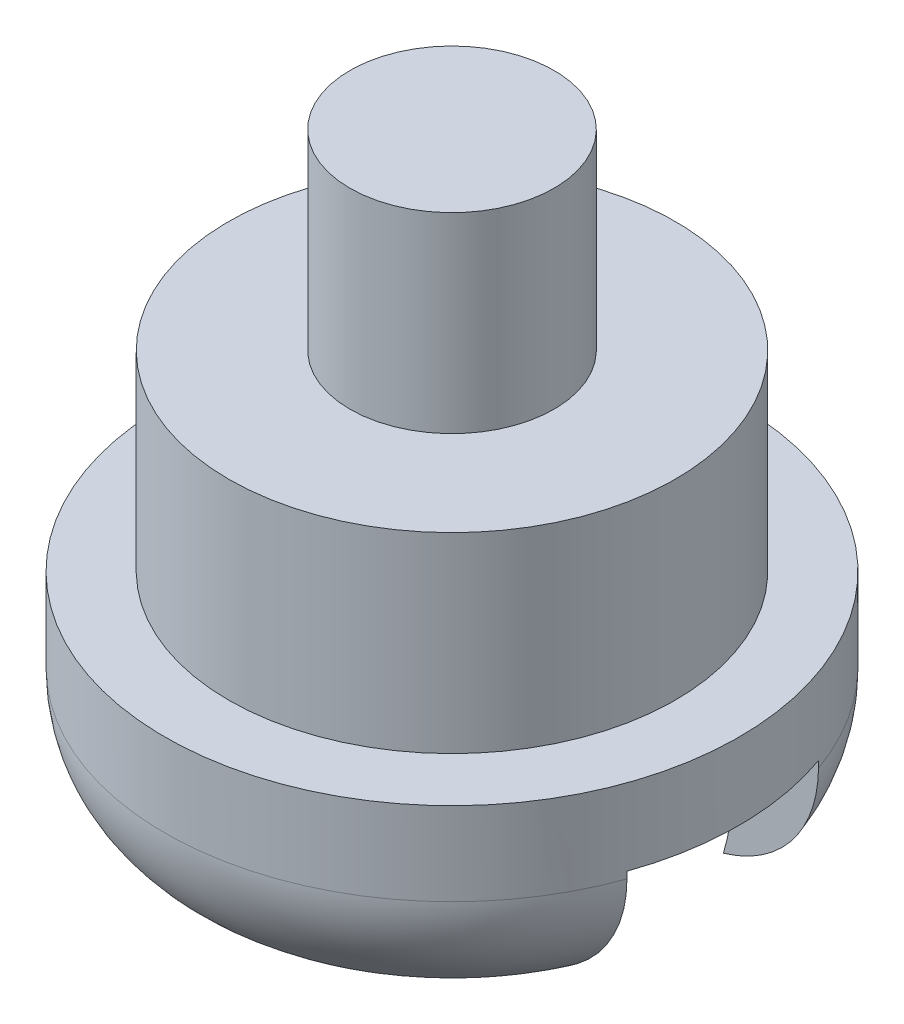
ISO-10303-21;
HEADER;
FILE_DESCRIPTION(('STEP AP214'),'2;1');
FILE_NAME('part.step','',(''),(''),'','','');
FILE_SCHEMA(('AUTOMOTIVE_DESIGN { 1 0 10303 214 1 1 1 1 }'));
ENDSEC;
DATA;
#1=APPLICATION_CONTEXT('core data for automotive mechanical design processes');
#2=APPLICATION_PROTOCOL_DEFINITION('international standard','automotive_design',2000,#1);
#3=PRODUCT_CONTEXT('',#1,'mechanical');
#4=PRODUCT('Part','Part','',(#3));
#5=PRODUCT_RELATED_PRODUCT_CATEGORY('part','',(#4));
#6=PRODUCT_DEFINITION_FORMATION('','',#4);
#7=PRODUCT_DEFINITION_CONTEXT('part definition',#1,'design');
#8=PRODUCT_DEFINITION('design','',#6,#7);
#9=PRODUCT_DEFINITION_SHAPE('','',#8);
#10=(LENGTH_UNIT() NAMED_UNIT(*) SI_UNIT(.MILLI.,.METRE.));
#11=(NAMED_UNIT(*) PLANE_ANGLE_UNIT() SI_UNIT($,.RADIAN.));
#12=(NAMED_UNIT(*) SI_UNIT($,.STERADIAN.) SOLID_ANGLE_UNIT());
#13=UNCERTAINTY_MEASURE_WITH_UNIT(LENGTH_MEASURE(1.E-05),#10,'distance_accuracy_value','');
#14=(GEOMETRIC_REPRESENTATION_CONTEXT(3) GLOBAL_UNCERTAINTY_ASSIGNED_CONTEXT((#13)) GLOBAL_UNIT_ASSIGNED_CONTEXT((#10,
#11,#12)) REPRESENTATION_CONTEXT('',''));
#15=CARTESIAN_POINT('',(0.,0.,0.));
#16=DIRECTION('',(0.,0.,1.));
#17=DIRECTION('',(1.,0.,0.));
#18=AXIS2_PLACEMENT_3D('',#15,#16,#17);
#19=CARTESIAN_POINT('',(0.,3.,0.));
#20=DIRECTION('',(0.,-1.,0.));
#21=DIRECTION('',(0.,0.,-1.));
#22=AXIS2_PLACEMENT_3D('',#19,#20,#21);
#23=CYLINDRICAL_SURFACE('',#22,3.5);
#24=CARTESIAN_POINT('',(0.,3.,0.));
#25=DIRECTION('',(0.,1.,0.));
#26=DIRECTION('',(0.,0.,1.));
#27=AXIS2_PLACEMENT_3D('',#24,#25,#26);
#28=CIRCLE('',#27,3.5);
#29=CARTESIAN_POINT('',(0.,3.,3.5));
#30=VERTEX_POINT('',#29);
#31=EDGE_CURVE('E209',#30,#30,#28,.T.);
#32=ORIENTED_EDGE('',*,*,#31,.F.);
#33=EDGE_LOOP('',(#32));
#34=FACE_BOUND('',#33,.T.);
#35=CARTESIAN_POINT('',(0.,0.,0.));
#36=DIRECTION('',(0.,1.,0.));
#37=DIRECTION('',(0.,0.,1.));
#38=AXIS2_PLACEMENT_3D('',#35,#36,#37);
#39=CIRCLE('',#38,3.5);
#40=CARTESIAN_POINT('',(0.,0.,3.5));
#41=VERTEX_POINT('',#40);
#42=EDGE_CURVE('E125',#41,#41,#39,.T.);
#43=ORIENTED_EDGE('',*,*,#42,.T.);
#44=EDGE_LOOP('',(#43));
#45=FACE_BOUND('',#44,.T.);
#46=ADVANCED_FACE('F33',(#34,#45),#23,.T.);
#47=CARTESIAN_POINT('',(0.,3.,0.));
#48=DIRECTION('',(0.,1.,0.));
#49=DIRECTION('',(0.,0.,1.));
#50=AXIS2_PLACEMENT_3D('',#47,#48,#49);
#51=PLANE('',#50);
#52=CARTESIAN_POINT('',(0.,3.,0.));
#53=DIRECTION('',(0.,1.,0.));
#54=DIRECTION('',(0.,0.,1.));
#55=AXIS2_PLACEMENT_3D('',#52,#53,#54);
#56=CIRCLE('',#55,1.6);
#57=CARTESIAN_POINT('',(0.,3.,1.6));
#58=VERTEX_POINT('',#57);
#59=EDGE_CURVE('E132',#58,#58,#56,.T.);
#60=ORIENTED_EDGE('',*,*,#59,.F.);
#61=EDGE_LOOP('',(#60));
#62=FACE_BOUND('',#61,.T.);
#63=ORIENTED_EDGE('',*,*,#31,.T.);
#64=EDGE_LOOP('',(#63));
#65=FACE_BOUND('',#64,.T.);
#66=ADVANCED_FACE('F214',(#62,#65),#51,.T.);
#67=CARTESIAN_POINT('',(0.,6.,0.));
#68=DIRECTION('',(0.,-1.,0.));
#69=DIRECTION('',(0.,0.,-1.));
#70=AXIS2_PLACEMENT_3D('',#67,#68,#69);
#71=CYLINDRICAL_SURFACE('',#70,1.6);
#72=CARTESIAN_POINT('',(0.,6.,0.));
#73=DIRECTION('',(0.,1.,0.));
#74=DIRECTION('',(0.,0.,1.));
#75=AXIS2_PLACEMENT_3D('',#72,#73,#74);
#76=CIRCLE('',#75,1.6);
#77=CARTESIAN_POINT('',(0.,6.,1.6));
#78=VERTEX_POINT('',#77);
#79=EDGE_CURVE('E206',#78,#78,#76,.T.);
#80=ORIENTED_EDGE('',*,*,#79,.F.);
#81=EDGE_LOOP('',(#80));
#82=FACE_BOUND('',#81,.T.);
#83=ORIENTED_EDGE('',*,*,#59,.T.);
#84=EDGE_LOOP('',(#83));
#85=FACE_BOUND('',#84,.T.);
#86=ADVANCED_FACE('F232',(#82,#85),#71,.T.);
#87=CARTESIAN_POINT('',(0.,6.,0.));
#88=DIRECTION('',(0.,1.,0.));
#89=DIRECTION('',(0.,0.,1.));
#90=AXIS2_PLACEMENT_3D('',#87,#88,#89);
#91=PLANE('',#90);
#92=ORIENTED_EDGE('',*,*,#79,.T.);
#93=EDGE_LOOP('',(#92));
#94=FACE_BOUND('',#93,.T.);
#95=ADVANCED_FACE('F227',(#94),#91,.T.);
#96=CARTESIAN_POINT('',(0.,-3.2,0.));
#97=DIRECTION('',(0.,1.,0.));
#98=DIRECTION('',(0.,0.,1.));
#99=AXIS2_PLACEMENT_3D('',#96,#97,#98);
#100=CYLINDRICAL_SURFACE('',#99,4.5);
#101=DIRECTION('',(0.,1.,0.));
#102=VECTOR('',#101,1.);
#103=CARTESIAN_POINT('',(4.24264068711928,-3.2,-1.5));
#104=LINE('',#103,#102);
#105=CARTESIAN_POINT('',(4.24264068711928,-1.2,-1.5));
#106=VERTEX_POINT('',#105);
#107=CARTESIAN_POINT('',(4.24264068711928,-1.30391335884106,-1.5));
#108=VERTEX_POINT('',#107);
#109=EDGE_CURVE('E178',#106,#108,#104,.F.);
#110=ORIENTED_EDGE('',*,*,#109,.T.);
#111=CARTESIAN_POINT('',(0.,-1.30391335884106,0.));
#112=DIRECTION('',(0.,-1.,0.));
#113=DIRECTION('',(0.,0.,-1.));
#114=AXIS2_PLACEMENT_3D('',#111,#112,#113);
#115=CIRCLE('',#114,4.5);
#116=CARTESIAN_POINT('',(-4.24264068711928,-1.30391335884106,-1.5));
#117=VERTEX_POINT('',#116);
#118=EDGE_CURVE('E165',#108,#117,#115,.F.);
#119=ORIENTED_EDGE('',*,*,#118,.T.);
#120=DIRECTION('',(0.,1.,0.));
#121=VECTOR('',#120,1.);
#122=CARTESIAN_POINT('',(-4.24264068711928,-3.2,-1.5));
#123=LINE('',#122,#121);
#124=CARTESIAN_POINT('',(-4.24264068711928,-1.2,-1.5));
#125=VERTEX_POINT('',#124);
#126=EDGE_CURVE('E128',#117,#125,#123,.T.);
#127=ORIENTED_EDGE('',*,*,#126,.T.);
#128=CARTESIAN_POINT('',(0.,-1.2,0.));
#129=DIRECTION('',(0.,-1.,0.));
#130=DIRECTION('',(0.,0.,-1.));
#131=AXIS2_PLACEMENT_3D('',#128,#129,#130);
#132=CIRCLE('',#131,4.5);
#133=CARTESIAN_POINT('',(-4.24264068711928,-1.2,1.5));
#134=VERTEX_POINT('',#133);
#135=EDGE_CURVE('E200',#134,#125,#132,.T.);
#136=ORIENTED_EDGE('',*,*,#135,.F.);
#137=DIRECTION('',(0.,1.,0.));
#138=VECTOR('',#137,1.);
#139=CARTESIAN_POINT('',(-4.24264068711928,-3.2,1.5));
#140=LINE('',#139,#138);
#141=CARTESIAN_POINT('',(-4.24264068711928,-1.30391335884106,1.5));
#142=VERTEX_POINT('',#141);
#143=EDGE_CURVE('E193',#134,#142,#140,.F.);
#144=ORIENTED_EDGE('',*,*,#143,.T.);
#145=CARTESIAN_POINT('',(0.,-1.30391335884106,0.));
#146=DIRECTION('',(0.,-1.,0.));
#147=DIRECTION('',(0.,0.,-1.));
#148=AXIS2_PLACEMENT_3D('',#145,#146,#147);
#149=CIRCLE('',#148,4.5);
#150=CARTESIAN_POINT('',(4.24264068711928,-1.30391335884106,1.5));
#151=VERTEX_POINT('',#150);
#152=EDGE_CURVE('E54',#142,#151,#149,.F.);
#153=ORIENTED_EDGE('',*,*,#152,.T.);
#154=DIRECTION('',(0.,1.,0.));
#155=VECTOR('',#154,1.);
#156=CARTESIAN_POINT('',(4.24264068711928,-3.2,1.5));
#157=LINE('',#156,#155);
#158=CARTESIAN_POINT('',(4.24264068711928,-1.2,1.5));
#159=VERTEX_POINT('',#158);
#160=EDGE_CURVE('E107',#151,#159,#157,.T.);
#161=ORIENTED_EDGE('',*,*,#160,.T.);
#162=EDGE_CURVE('E202',#106,#159,#132,.T.);
#163=ORIENTED_EDGE('',*,*,#162,.F.);
#164=EDGE_LOOP('',(#110,#119,#127,#136,#144,#153,#161,#163));
#165=FACE_BOUND('',#164,.T.);
#166=CARTESIAN_POINT('',(0.,0.,0.));
#167=DIRECTION('',(0.,-1.,0.));
#168=DIRECTION('',(0.,0.,-1.));
#169=AXIS2_PLACEMENT_3D('',#166,#167,#168);
#170=CIRCLE('',#169,4.5);
#171=CARTESIAN_POINT('',(0.,0.,-4.5));
#172=VERTEX_POINT('',#171);
#173=EDGE_CURVE('E121',#172,#172,#170,.T.);
#174=ORIENTED_EDGE('',*,*,#173,.T.);
#175=EDGE_LOOP('',(#174));
#176=FACE_BOUND('',#175,.T.);
#177=ADVANCED_FACE('F173',(#165,#176),#100,.T.);
#178=CARTESIAN_POINT('',(0.,0.,0.));
#179=DIRECTION('',(0.,-1.,0.));
#180=DIRECTION('',(0.,0.,-1.));
#181=AXIS2_PLACEMENT_3D('',#178,#179,#180);
#182=PLANE('',#181);
#183=ORIENTED_EDGE('',*,*,#42,.F.);
#184=EDGE_LOOP('',(#183));
#185=FACE_BOUND('',#184,.T.);
#186=ORIENTED_EDGE('',*,*,#173,.F.);
#187=EDGE_LOOP('',(#186));
#188=FACE_BOUND('',#187,.T.);
#189=ADVANCED_FACE('F221',(#185,#188),#182,.F.);
#190=CARTESIAN_POINT('',(0.,-2.34780757148509,0.));
#191=DIRECTION('',(0.,1.,0.));
#192=DIRECTION('',(0.,0.,-1.));
#193=AXIS2_PLACEMENT_3D('',#190,#191,#192);
#194=SPHERICAL_SURFACE('',#193,3.25);
#195=CARTESIAN_POINT('',(0.,-1.2,0.));
#196=DIRECTION('',(0.,-1.,0.));
#197=DIRECTION('',(0.,0.,-1.));
#198=AXIS2_PLACEMENT_3D('',#195,#196,#197);
#199=CIRCLE('',#198,3.04056537157837);
#200=CARTESIAN_POINT('',(-2.64481337315916,-1.2,-1.5));
#201=VERTEX_POINT('',#200);
#202=CARTESIAN_POINT('',(-2.64481337315916,-1.2,1.5));
#203=VERTEX_POINT('',#202);
#204=EDGE_CURVE('E133',#201,#203,#199,.F.);
#205=ORIENTED_EDGE('',*,*,#204,.F.);
#206=CARTESIAN_POINT('',(0.,-2.34780757148509,-1.5));
#207=DIRECTION('',(0.,0.,-1.));
#208=DIRECTION('',(-1.,0.,0.));
#209=AXIS2_PLACEMENT_3D('',#206,#207,#208);
#210=CIRCLE('',#209,2.8831406486677);
#211=CARTESIAN_POINT('',(-2.75431807618181,-3.2,-1.5));
#212=VERTEX_POINT('',#211);
#213=EDGE_CURVE('E136',#201,#212,#210,.F.);
#214=ORIENTED_EDGE('',*,*,#213,.T.);
#215=CARTESIAN_POINT('',(0.,-3.2,0.));
#216=DIRECTION('',(0.,-1.,0.));
#217=DIRECTION('',(0.,0.,-1.));
#218=AXIS2_PLACEMENT_3D('',#215,#216,#217);
#219=CIRCLE('',#218,3.13628252311265);
#220=CARTESIAN_POINT('',(2.75431807618181,-3.2,-1.5));
#221=VERTEX_POINT('',#220);
#222=EDGE_CURVE('E122',#212,#221,#219,.T.);
#223=ORIENTED_EDGE('',*,*,#222,.T.);
#224=CARTESIAN_POINT('',(2.64481337315916,-1.2,-1.5));
#225=VERTEX_POINT('',#224);
#226=EDGE_CURVE('E118',#221,#225,#210,.F.);
#227=ORIENTED_EDGE('',*,*,#226,.T.);
#228=CARTESIAN_POINT('',(2.64481337315916,-1.2,1.5));
#229=VERTEX_POINT('',#228);
#230=EDGE_CURVE('E117',#229,#225,#199,.F.);
#231=ORIENTED_EDGE('',*,*,#230,.F.);
#232=CARTESIAN_POINT('',(0.,-2.34780757148509,1.5));
#233=DIRECTION('',(0.,0.,1.));
#234=DIRECTION('',(1.,0.,0.));
#235=AXIS2_PLACEMENT_3D('',#232,#233,#234);
#236=CIRCLE('',#235,2.8831406486677);
#237=CARTESIAN_POINT('',(2.75431807618181,-3.2,1.5));
#238=VERTEX_POINT('',#237);
#239=EDGE_CURVE('E105',#229,#238,#236,.F.);
#240=ORIENTED_EDGE('',*,*,#239,.T.);
#241=CARTESIAN_POINT('',(-2.75431807618181,-3.2,1.5));
#242=VERTEX_POINT('',#241);
#243=EDGE_CURVE('E115',#238,#242,#219,.T.);
#244=ORIENTED_EDGE('',*,*,#243,.T.);
#245=EDGE_CURVE('E120',#242,#203,#236,.F.);
#246=ORIENTED_EDGE('',*,*,#245,.T.);
#247=EDGE_LOOP('',(#205,#214,#223,#227,#231,#240,#244,#246));
#248=FACE_BOUND('',#247,.T.);
#249=ADVANCED_FACE('F113',(#248),#194,.F.);
#250=CARTESIAN_POINT('',(0.,-1.2,0.));
#251=DIRECTION('',(0.,-1.,0.));
#252=DIRECTION('',(0.,0.,-1.));
#253=AXIS2_PLACEMENT_3D('',#250,#251,#252);
#254=PLANE('',#253);
#255=ORIENTED_EDGE('',*,*,#162,.T.);
#256=DIRECTION('',(-1.,0.,0.));
#257=VECTOR('',#256,1.);
#258=CARTESIAN_POINT('',(-6.,-1.2,1.5));
#259=LINE('',#258,#257);
#260=EDGE_CURVE('E194',#159,#229,#259,.T.);
#261=ORIENTED_EDGE('',*,*,#260,.T.);
#262=ORIENTED_EDGE('',*,*,#230,.T.);
#263=DIRECTION('',(1.,0.,0.));
#264=VECTOR('',#263,1.);
#265=CARTESIAN_POINT('',(-6.,-1.2,-1.5));
#266=LINE('',#265,#264);
#267=EDGE_CURVE('E196',#225,#106,#266,.T.);
#268=ORIENTED_EDGE('',*,*,#267,.T.);
#269=EDGE_LOOP('',(#255,#261,#262,#268));
#270=FACE_BOUND('',#269,.T.);
#271=ADVANCED_FACE('F155',(#270),#254,.T.);
#272=CARTESIAN_POINT('',(-6.,-1.2,1.5));
#273=DIRECTION('',(0.,0.,1.));
#274=DIRECTION('',(1.,0.,0.));
#275=AXIS2_PLACEMENT_3D('',#272,#273,#274);
#276=PLANE('',#275);
#277=ORIENTED_EDGE('',*,*,#160,.F.);
#278=CARTESIAN_POINT('',(4.24264068711928,-1.30391335884106,1.5));
#279=CARTESIAN_POINT('',(4.24264121688192,-1.35749779694682,1.5));
#280=CARTESIAN_POINT('',(4.24035506320627,-1.41105605683113,1.5));
#281=CARTESIAN_POINT('',(4.23124089737903,-1.51777866850839,1.5));
#282=CARTESIAN_POINT('',(4.22441339750654,-1.57094306404667,1.5));
#283=CARTESIAN_POINT('',(4.19720407069978,-1.72912632414098,1.5));
#284=CARTESIAN_POINT('',(4.17009511148904,-1.83306651606445,1.5));
#285=CARTESIAN_POINT('',(4.0988455828299,-2.03487779283212,1.5));
#286=CARTESIAN_POINT('',(4.05470289079472,-2.13274811954079,1.5));
#287=CARTESIAN_POINT('',(3.95087113952612,-2.31980498125347,1.5));
#288=CARTESIAN_POINT('',(3.89118822754036,-2.40899493083381,1.5));
#289=CARTESIAN_POINT('',(3.75716820404473,-2.57778555786167,1.5));
#290=CARTESIAN_POINT('',(3.68262272978336,-2.65722043869933,1.5));
#291=CARTESIAN_POINT('',(3.52173665441114,-2.80322755954762,1.5));
#292=CARTESIAN_POINT('',(3.43538180230087,-2.86978402049879,1.5));
#293=CARTESIAN_POINT('',(3.25340963919799,-2.98882616900365,1.5));
#294=CARTESIAN_POINT('',(3.15778837137187,-3.04130580928185,1.5));
#295=CARTESIAN_POINT('',(3.00958689664503,-3.10901341937012,1.5));
#296=CARTESIAN_POINT('',(2.95943499836666,-3.12973469279114,1.5));
#297=CARTESIAN_POINT('',(2.85780699359653,-3.1675636437602,1.5));
#298=CARTESIAN_POINT('',(2.80633141018122,-3.18467272483896,1.5));
#299=CARTESIAN_POINT('',(2.75431807618181,-3.2,1.5));
#300=B_SPLINE_CURVE_WITH_KNOTS('',3,(#278,#279,#280,#281,#282,#283,#284,#285,#286,#287,#288,
#289,#290,#291,#292,#293,#294,#295,#296,#297,#298,#299),.UNSPECIFIED.,.F.,.F.,(4,2,2,2,2,2,2,2,
2,2,4),(0.,0.160652816427078,0.321287513749753,0.641872134519393,0.962496716496861,
1.2829946611222,1.60834940209935,1.93410028857557,2.25999089139115,2.42266684873645,
2.58527948093289),.UNSPECIFIED.);
#301=EDGE_CURVE('E11',#151,#238,#300,.T.);
#302=ORIENTED_EDGE('',*,*,#301,.T.);
#303=ORIENTED_EDGE('',*,*,#239,.F.);
#304=ORIENTED_EDGE('',*,*,#260,.F.);
#305=EDGE_LOOP('',(#277,#302,#303,#304));
#306=FACE_BOUND('',#305,.T.);
#307=ADVANCED_FACE('F103',(#306),#276,.F.);
#308=CARTESIAN_POINT('',(-6.,-1.2,-1.5));
#309=DIRECTION('',(0.,0.,-1.));
#310=DIRECTION('',(-1.,0.,0.));
#311=AXIS2_PLACEMENT_3D('',#308,#309,#310);
#312=PLANE('',#311);
#313=ORIENTED_EDGE('',*,*,#226,.F.);
#314=CARTESIAN_POINT('',(2.75431807618181,-3.2,-1.5));
#315=CARTESIAN_POINT('',(2.82002868187701,-3.18065056634793,-1.5));
#316=CARTESIAN_POINT('',(2.88491254379954,-3.15842297888763,-1.5));
#317=CARTESIAN_POINT('',(3.0124621623378,-3.10818688606501,-1.5));
#318=CARTESIAN_POINT('',(3.07512599204574,-3.08017349620432,-1.5));
#319=CARTESIAN_POINT('',(3.19769412407907,-3.01830497503552,-1.5));
#320=CARTESIAN_POINT('',(3.25759195156451,-2.98443693813325,-1.5));
#321=CARTESIAN_POINT('',(3.37378420029984,-2.91107588700106,-1.5));
#322=CARTESIAN_POINT('',(3.43008001780141,-2.87158507171717,-1.5));
#323=CARTESIAN_POINT('',(3.58217508435852,-2.75311096780176,-1.5));
#324=CARTESIAN_POINT('',(3.67328016429209,-2.66793355616589,-1.5));
#325=CARTESIAN_POINT('',(3.83785988503743,-2.48227209254158,-1.5));
#326=CARTESIAN_POINT('',(3.91136862604433,-2.381818273286,-1.5));
#327=CARTESIAN_POINT('',(4.03202341125207,-2.17866901940774,-1.5));
#328=CARTESIAN_POINT('',(4.08098340070368,-2.07704757368776,-1.5));
#329=CARTESIAN_POINT('',(4.16026099844647,-1.8667659230589,-1.5));
#330=CARTESIAN_POINT('',(4.19059113680881,-1.75811050355055,-1.5));
#331=CARTESIAN_POINT('',(4.22155996762902,-1.59100441528704,-1.5));
#332=CARTESIAN_POINT('',(4.2294648242157,-1.53381270875639,-1.5));
#333=CARTESIAN_POINT('',(4.24000045698999,-1.41906153224434,-1.5));
#334=CARTESIAN_POINT('',(4.24264179742951,-1.36150303199039,-1.5));
#335=CARTESIAN_POINT('',(4.24264068711928,-1.30391335884106,-1.5));
#336=B_SPLINE_CURVE_WITH_KNOTS('',3,(#314,#315,#316,#317,#318,#319,#320,#321,#322,#323,#324,
#325,#326,#327,#328,#329,#330,#331,#332,#333,#334,#335),.UNSPECIFIED.,.F.,.F.,(4,2,2,2,2,2,2,2,
2,2,4),(0.,0.205464657972294,0.411103487866199,0.617201533308913,0.823219198560666,
1.19513479407298,1.56632370597892,1.9030507432011,2.23955105574502,2.41254565153727,
2.58519268372883),.UNSPECIFIED.);
#337=EDGE_CURVE('E137',#221,#108,#336,.T.);
#338=ORIENTED_EDGE('',*,*,#337,.T.);
#339=ORIENTED_EDGE('',*,*,#109,.F.);
#340=ORIENTED_EDGE('',*,*,#267,.F.);
#341=EDGE_LOOP('',(#313,#338,#339,#340));
#342=FACE_BOUND('',#341,.T.);
#343=ADVANCED_FACE('F153',(#342),#312,.F.);
#344=ORIENTED_EDGE('',*,*,#126,.F.);
#345=CARTESIAN_POINT('',(-4.24264068711928,-1.30391335884106,-1.5));
#346=CARTESIAN_POINT('',(-4.24264121688192,-1.35749779694682,-1.5));
#347=CARTESIAN_POINT('',(-4.24035506320627,-1.41105605683113,-1.5));
#348=CARTESIAN_POINT('',(-4.23124089737903,-1.51777866850839,-1.5));
#349=CARTESIAN_POINT('',(-4.22441339750654,-1.57094306404667,-1.5));
#350=CARTESIAN_POINT('',(-4.19720407069978,-1.72912632414098,-1.5));
#351=CARTESIAN_POINT('',(-4.17009511148904,-1.83306651606445,-1.5));
#352=CARTESIAN_POINT('',(-4.0988455828299,-2.03487779283212,-1.5));
#353=CARTESIAN_POINT('',(-4.05470289079472,-2.13274811954079,-1.5));
#354=CARTESIAN_POINT('',(-3.95087113952612,-2.31980498125347,-1.5));
#355=CARTESIAN_POINT('',(-3.89118822754036,-2.40899493083381,-1.5));
#356=CARTESIAN_POINT('',(-3.75716820404473,-2.57778555786167,-1.5));
#357=CARTESIAN_POINT('',(-3.68262272978336,-2.65722043869933,-1.5));
#358=CARTESIAN_POINT('',(-3.52173665441114,-2.80322755954762,-1.5));
#359=CARTESIAN_POINT('',(-3.43538180230087,-2.86978402049879,-1.5));
#360=CARTESIAN_POINT('',(-3.25340963919799,-2.98882616900365,-1.5));
#361=CARTESIAN_POINT('',(-3.15778837137187,-3.04130580928185,-1.5));
#362=CARTESIAN_POINT('',(-3.00958689664503,-3.10901341937012,-1.5));
#363=CARTESIAN_POINT('',(-2.95943499836666,-3.12973469279114,-1.5));
#364=CARTESIAN_POINT('',(-2.85780699359653,-3.1675636437602,-1.5));
#365=CARTESIAN_POINT('',(-2.80633141018122,-3.18467272483896,-1.5));
#366=CARTESIAN_POINT('',(-2.75431807618181,-3.2,-1.5));
#367=B_SPLINE_CURVE_WITH_KNOTS('',3,(#345,#346,#347,#348,#349,#350,#351,#352,#353,#354,#355,
#356,#357,#358,#359,#360,#361,#362,#363,#364,#365,#366),.UNSPECIFIED.,.F.,.F.,(4,2,2,2,2,2,2,2,
2,2,4),(0.,0.160652816427078,0.321287513749753,0.641872134519392,0.962496716496861,
1.2829946611222,1.60834940209935,1.93410028857557,2.25999089139115,2.42266684873645,
2.58527948093289),.UNSPECIFIED.);
#368=EDGE_CURVE('E160',#117,#212,#367,.T.);
#369=ORIENTED_EDGE('',*,*,#368,.T.);
#370=ORIENTED_EDGE('',*,*,#213,.F.);
#371=EDGE_CURVE('E184',#125,#201,#266,.T.);
#372=ORIENTED_EDGE('',*,*,#371,.F.);
#373=EDGE_LOOP('',(#344,#369,#370,#372));
#374=FACE_BOUND('',#373,.T.);
#375=ADVANCED_FACE('F148',(#374),#312,.F.);
#376=ORIENTED_EDGE('',*,*,#245,.F.);
#377=CARTESIAN_POINT('',(-2.75431807618181,-3.2,1.5));
#378=CARTESIAN_POINT('',(-2.82002868187701,-3.18065056634793,1.5));
#379=CARTESIAN_POINT('',(-2.88491254379953,-3.15842297888763,1.5));
#380=CARTESIAN_POINT('',(-3.0124621623378,-3.10818688606501,1.5));
#381=CARTESIAN_POINT('',(-3.07512599204574,-3.08017349620432,1.5));
#382=CARTESIAN_POINT('',(-3.19769412407907,-3.01830497503552,1.5));
#383=CARTESIAN_POINT('',(-3.25759195156451,-2.98443693813325,1.5));
#384=CARTESIAN_POINT('',(-3.37378420029984,-2.91107588700106,1.5));
#385=CARTESIAN_POINT('',(-3.43008001780141,-2.87158507171717,1.5));
#386=CARTESIAN_POINT('',(-3.58217508435852,-2.75311096780176,1.5));
#387=CARTESIAN_POINT('',(-3.67328016429209,-2.66793355616589,1.5));
#388=CARTESIAN_POINT('',(-3.83785988503743,-2.48227209254158,1.5));
#389=CARTESIAN_POINT('',(-3.91136862604433,-2.381818273286,1.5));
#390=CARTESIAN_POINT('',(-4.03202341125207,-2.17866901940774,1.5));
#391=CARTESIAN_POINT('',(-4.08098340070368,-2.07704757368776,1.5));
#392=CARTESIAN_POINT('',(-4.16026099844647,-1.8667659230589,1.5));
#393=CARTESIAN_POINT('',(-4.19059113680881,-1.75811050355055,1.5));
#394=CARTESIAN_POINT('',(-4.22155996762902,-1.59100441528704,1.5));
#395=CARTESIAN_POINT('',(-4.2294648242157,-1.53381270875639,1.5));
#396=CARTESIAN_POINT('',(-4.24000045698999,-1.41906153224434,1.5));
#397=CARTESIAN_POINT('',(-4.24264179742951,-1.36150303199039,1.5));
#398=CARTESIAN_POINT('',(-4.24264068711928,-1.30391335884106,1.5));
#399=B_SPLINE_CURVE_WITH_KNOTS('',3,(#377,#378,#379,#380,#381,#382,#383,#384,#385,#386,#387,
#388,#389,#390,#391,#392,#393,#394,#395,#396,#397,#398),.UNSPECIFIED.,.F.,.F.,(4,2,2,2,2,2,2,2,
2,2,4),(0.,0.205464657972294,0.411103487866199,0.617201533308913,0.823219198560667,
1.19513479407298,1.56632370597892,1.9030507432011,2.23955105574502,2.41254565153727,
2.58519268372883),.UNSPECIFIED.);
#400=EDGE_CURVE('E47',#242,#142,#399,.T.);
#401=ORIENTED_EDGE('',*,*,#400,.T.);
#402=ORIENTED_EDGE('',*,*,#143,.F.);
#403=EDGE_CURVE('E192',#203,#134,#259,.T.);
#404=ORIENTED_EDGE('',*,*,#403,.F.);
#405=EDGE_LOOP('',(#376,#401,#402,#404));
#406=FACE_BOUND('',#405,.T.);
#407=ADVANCED_FACE('F152',(#406),#276,.F.);
#408=ORIENTED_EDGE('',*,*,#135,.T.);
#409=ORIENTED_EDGE('',*,*,#371,.T.);
#410=ORIENTED_EDGE('',*,*,#204,.T.);
#411=ORIENTED_EDGE('',*,*,#403,.T.);
#412=EDGE_LOOP('',(#408,#409,#410,#411));
#413=FACE_BOUND('',#412,.T.);
#414=ADVANCED_FACE('F191',(#413),#254,.T.);
#415=CARTESIAN_POINT('',(0.,-1.30391335884106,0.));
#416=DIRECTION('',(0.,-1.,0.));
#417=DIRECTION('',(0.,0.,-1.));
#418=AXIS2_PLACEMENT_3D('',#415,#416,#417);
#419=TOROIDAL_SURFACE('',#418,2.5,2.);
#420=ORIENTED_EDGE('',*,*,#368,.F.);
#421=ORIENTED_EDGE('',*,*,#118,.F.);
#422=ORIENTED_EDGE('',*,*,#337,.F.);
#423=ORIENTED_EDGE('',*,*,#222,.F.);
#424=EDGE_LOOP('',(#420,#421,#422,#423));
#425=FACE_BOUND('',#424,.T.);
#426=ADVANCED_FACE('F145',(#425),#419,.T.);
#427=CARTESIAN_POINT('',(0.,-1.30391335884106,0.));
#428=DIRECTION('',(0.,-1.,0.));
#429=DIRECTION('',(0.,0.,-1.));
#430=AXIS2_PLACEMENT_3D('',#427,#428,#429);
#431=TOROIDAL_SURFACE('',#430,2.5,2.);
#432=ORIENTED_EDGE('',*,*,#301,.F.);
#433=ORIENTED_EDGE('',*,*,#152,.F.);
#434=ORIENTED_EDGE('',*,*,#400,.F.);
#435=ORIENTED_EDGE('',*,*,#243,.F.);
#436=EDGE_LOOP('',(#432,#433,#434,#435));
#437=FACE_BOUND('',#436,.T.);
#438=ADVANCED_FACE('F35',(#437),#431,.T.);
#439=CLOSED_SHELL('',(#46,#66,#86,#95,#177,#189,#249,#271,#307,#343,#375,#407,#414,#426,#438));
#440=MANIFOLD_SOLID_BREP('B2',#439);
#441=ADVANCED_BREP_SHAPE_REPRESENTATION('',(#18,#440),#14);
#442=SHAPE_DEFINITION_REPRESENTATION(#9,#441);
ENDSEC;
END-ISO-10303-21;
